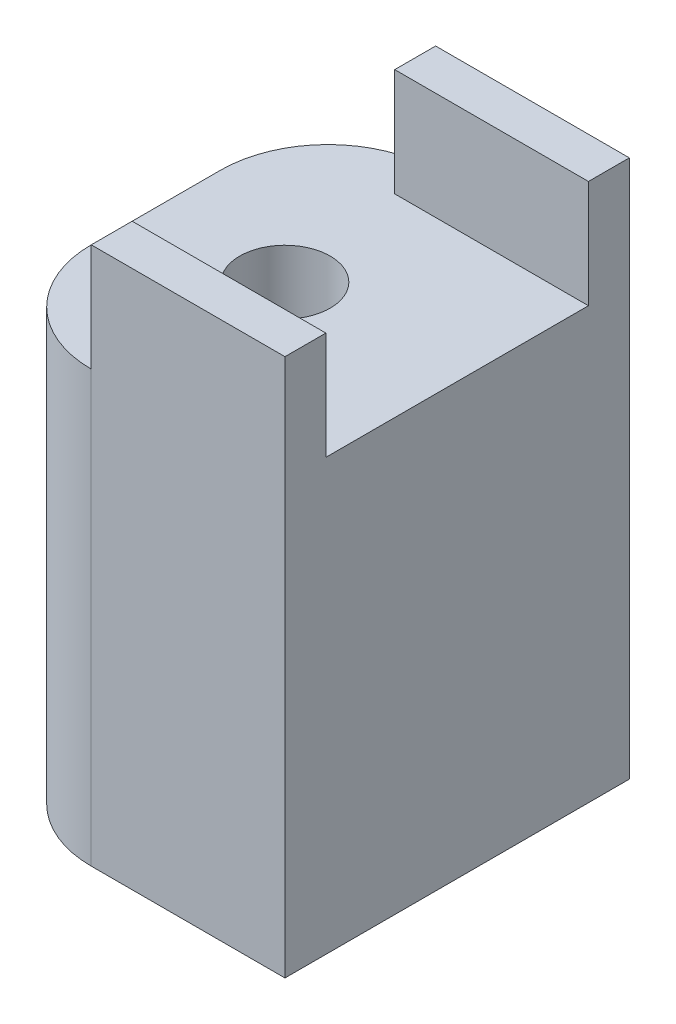
ISO-10303-21;
HEADER;
FILE_DESCRIPTION(('STEP AP214'),'2;1');
FILE_NAME('part.step','',(''),(''),'','','');
FILE_SCHEMA(('AUTOMOTIVE_DESIGN { 1 0 10303 214 1 1 1 1 }'));
ENDSEC;
DATA;
#1=APPLICATION_CONTEXT('core data for automotive mechanical design processes');
#2=APPLICATION_PROTOCOL_DEFINITION('international standard','automotive_design',2000,#1);
#3=PRODUCT_CONTEXT('',#1,'mechanical');
#4=PRODUCT('Part','Part','',(#3));
#5=PRODUCT_RELATED_PRODUCT_CATEGORY('part','',(#4));
#6=PRODUCT_DEFINITION_FORMATION('','',#4);
#7=PRODUCT_DEFINITION_CONTEXT('part definition',#1,'design');
#8=PRODUCT_DEFINITION('design','',#6,#7);
#9=PRODUCT_DEFINITION_SHAPE('','',#8);
#10=(LENGTH_UNIT() NAMED_UNIT(*) SI_UNIT(.MILLI.,.METRE.));
#11=(NAMED_UNIT(*) PLANE_ANGLE_UNIT() SI_UNIT($,.RADIAN.));
#12=(NAMED_UNIT(*) SI_UNIT($,.STERADIAN.) SOLID_ANGLE_UNIT());
#13=UNCERTAINTY_MEASURE_WITH_UNIT(LENGTH_MEASURE(1.E-05),#10,'distance_accuracy_value','');
#14=(GEOMETRIC_REPRESENTATION_CONTEXT(3) GLOBAL_UNCERTAINTY_ASSIGNED_CONTEXT((#13)) GLOBAL_UNIT_ASSIGNED_CONTEXT((#10,
#11,#12)) REPRESENTATION_CONTEXT('',''));
#15=CARTESIAN_POINT('',(0.,0.,0.));
#16=DIRECTION('',(0.,0.,1.));
#17=DIRECTION('',(1.,0.,0.));
#18=AXIS2_PLACEMENT_3D('',#15,#16,#17);
#19=CARTESIAN_POINT('',(0.,20.,0.));
#20=DIRECTION('',(0.,1.,0.));
#21=DIRECTION('',(0.,0.,1.));
#22=AXIS2_PLACEMENT_3D('',#19,#20,#21);
#23=PLANE('',#22);
#24=CARTESIAN_POINT('',(0.,20.,0.));
#25=DIRECTION('',(0.,1.,0.));
#26=DIRECTION('',(0.,0.,1.));
#27=AXIS2_PLACEMENT_3D('',#24,#25,#26);
#28=CIRCLE('',#27,2.1);
#29=CARTESIAN_POINT('',(0.,20.,2.1));
#30=VERTEX_POINT('',#29);
#31=EDGE_CURVE('E191',#30,#30,#28,.T.);
#32=ORIENTED_EDGE('',*,*,#31,.F.);
#33=EDGE_LOOP('',(#32));
#34=FACE_BOUND('',#33,.T.);
#35=DIRECTION('',(0.,0.,1.));
#36=VECTOR('',#35,1.);
#37=CARTESIAN_POINT('',(-1.,20.,8.));
#38=LINE('',#37,#36);
#39=CARTESIAN_POINT('',(-0.999999999999999,20.,6.1));
#40=VERTEX_POINT('',#39);
#41=CARTESIAN_POINT('',(-1.,20.,8.));
#42=VERTEX_POINT('',#41);
#43=EDGE_CURVE('E127',#40,#42,#38,.T.);
#44=ORIENTED_EDGE('',*,*,#43,.F.);
#45=DIRECTION('',(-1.,0.,0.));
#46=VECTOR('',#45,1.);
#47=CARTESIAN_POINT('',(8.,20.,6.1));
#48=LINE('',#47,#46);
#49=CARTESIAN_POINT('',(8.,20.,6.1));
#50=VERTEX_POINT('',#49);
#51=EDGE_CURVE('E133',#50,#40,#48,.T.);
#52=ORIENTED_EDGE('',*,*,#51,.F.);
#53=DIRECTION('',(0.,0.,1.));
#54=VECTOR('',#53,1.);
#55=CARTESIAN_POINT('',(8.,20.,0.));
#56=LINE('',#55,#54);
#57=CARTESIAN_POINT('',(8.,20.,-6.1));
#58=VERTEX_POINT('',#57);
#59=EDGE_CURVE('E66',#58,#50,#56,.T.);
#60=ORIENTED_EDGE('',*,*,#59,.F.);
#61=DIRECTION('',(1.,0.,0.));
#62=VECTOR('',#61,1.);
#63=CARTESIAN_POINT('',(8.,20.,-6.1));
#64=LINE('',#63,#62);
#65=CARTESIAN_POINT('',(-1.,20.,-6.1));
#66=VERTEX_POINT('',#65);
#67=EDGE_CURVE('E221',#66,#58,#64,.T.);
#68=ORIENTED_EDGE('',*,*,#67,.F.);
#69=DIRECTION('',(0.,0.,1.));
#70=VECTOR('',#69,1.);
#71=CARTESIAN_POINT('',(-1.,20.,-8.));
#72=LINE('',#71,#70);
#73=CARTESIAN_POINT('',(-1.,20.,-8.));
#74=VERTEX_POINT('',#73);
#75=EDGE_CURVE('E168',#74,#66,#72,.T.);
#76=ORIENTED_EDGE('',*,*,#75,.F.);
#77=CARTESIAN_POINT('',(-1.,20.,-3.));
#78=DIRECTION('',(0.,1.,0.));
#79=DIRECTION('',(0.,0.,1.));
#80=AXIS2_PLACEMENT_3D('',#77,#78,#79);
#81=CIRCLE('',#80,5.);
#82=CARTESIAN_POINT('',(-6.,20.,-3.));
#83=VERTEX_POINT('',#82);
#84=EDGE_CURVE('E51',#74,#83,#81,.T.);
#85=ORIENTED_EDGE('',*,*,#84,.T.);
#86=DIRECTION('',(0.,0.,1.));
#87=VECTOR('',#86,1.);
#88=CARTESIAN_POINT('',(-6.,20.,0.));
#89=LINE('',#88,#87);
#90=CARTESIAN_POINT('',(-6.,20.,3.));
#91=VERTEX_POINT('',#90);
#92=EDGE_CURVE('E147',#83,#91,#89,.T.);
#93=ORIENTED_EDGE('',*,*,#92,.T.);
#94=CARTESIAN_POINT('',(-1.,20.,3.));
#95=DIRECTION('',(0.,1.,0.));
#96=DIRECTION('',(0.,0.,1.));
#97=AXIS2_PLACEMENT_3D('',#94,#95,#96);
#98=CIRCLE('',#97,5.);
#99=EDGE_CURVE('E145',#91,#42,#98,.T.);
#100=ORIENTED_EDGE('',*,*,#99,.T.);
#101=EDGE_LOOP('',(#44,#52,#60,#68,#76,#85,#93,#100));
#102=FACE_BOUND('',#101,.T.);
#103=ADVANCED_FACE('F43',(#34,#102),#23,.T.);
#104=CARTESIAN_POINT('',(0.,20.,8.));
#105=DIRECTION('',(0.,0.,-1.));
#106=DIRECTION('',(-1.,0.,0.));
#107=AXIS2_PLACEMENT_3D('',#104,#105,#106);
#108=PLANE('',#107);
#109=DIRECTION('',(0.,-1.,0.));
#110=VECTOR('',#109,1.);
#111=CARTESIAN_POINT('',(8.,20.,8.));
#112=LINE('',#111,#110);
#113=CARTESIAN_POINT('',(8.,25.,8.));
#114=VERTEX_POINT('',#113);
#115=CARTESIAN_POINT('',(8.,0.,8.));
#116=VERTEX_POINT('',#115);
#117=EDGE_CURVE('E198',#114,#116,#112,.T.);
#118=ORIENTED_EDGE('',*,*,#117,.F.);
#119=DIRECTION('',(1.,0.,0.));
#120=VECTOR('',#119,1.);
#121=CARTESIAN_POINT('',(8.,25.,8.));
#122=LINE('',#121,#120);
#123=CARTESIAN_POINT('',(-1.,25.,8.));
#124=VERTEX_POINT('',#123);
#125=EDGE_CURVE('E134',#124,#114,#122,.T.);
#126=ORIENTED_EDGE('',*,*,#125,.F.);
#127=DIRECTION('',(0.,-1.,0.));
#128=VECTOR('',#127,1.);
#129=CARTESIAN_POINT('',(-1.,25.,8.));
#130=LINE('',#129,#128);
#131=EDGE_CURVE('E130',#124,#42,#130,.T.);
#132=ORIENTED_EDGE('',*,*,#131,.T.);
#133=DIRECTION('',(0.,-1.,0.));
#134=VECTOR('',#133,1.);
#135=CARTESIAN_POINT('',(-1.,20.,8.));
#136=LINE('',#135,#134);
#137=CARTESIAN_POINT('',(-1.,0.,8.));
#138=VERTEX_POINT('',#137);
#139=EDGE_CURVE('E11',#42,#138,#136,.T.);
#140=ORIENTED_EDGE('',*,*,#139,.T.);
#141=DIRECTION('',(1.,0.,0.));
#142=VECTOR('',#141,1.);
#143=CARTESIAN_POINT('',(0.,0.,8.));
#144=LINE('',#143,#142);
#145=EDGE_CURVE('E193',#138,#116,#144,.T.);
#146=ORIENTED_EDGE('',*,*,#145,.T.);
#147=EDGE_LOOP('',(#118,#126,#132,#140,#146));
#148=FACE_BOUND('',#147,.T.);
#149=ADVANCED_FACE('F137',(#148),#108,.F.);
#150=CARTESIAN_POINT('',(8.,20.,0.));
#151=DIRECTION('',(1.,0.,0.));
#152=DIRECTION('',(0.,0.,-1.));
#153=AXIS2_PLACEMENT_3D('',#150,#151,#152);
#154=PLANE('',#153);
#155=DIRECTION('',(0.,0.,1.));
#156=VECTOR('',#155,1.);
#157=CARTESIAN_POINT('',(8.,0.,0.));
#158=LINE('',#157,#156);
#159=CARTESIAN_POINT('',(8.,0.,-8.));
#160=VERTEX_POINT('',#159);
#161=EDGE_CURVE('E189',#160,#116,#158,.T.);
#162=ORIENTED_EDGE('',*,*,#161,.F.);
#163=DIRECTION('',(0.,-1.,0.));
#164=VECTOR('',#163,1.);
#165=CARTESIAN_POINT('',(8.,20.,-8.));
#166=LINE('',#165,#164);
#167=CARTESIAN_POINT('',(8.,25.,-8.));
#168=VERTEX_POINT('',#167);
#169=EDGE_CURVE('E175',#168,#160,#166,.T.);
#170=ORIENTED_EDGE('',*,*,#169,.F.);
#171=DIRECTION('',(0.,0.,-1.));
#172=VECTOR('',#171,1.);
#173=CARTESIAN_POINT('',(8.,25.,-8.));
#174=LINE('',#173,#172);
#175=CARTESIAN_POINT('',(8.,25.,-6.1));
#176=VERTEX_POINT('',#175);
#177=EDGE_CURVE('E223',#176,#168,#174,.T.);
#178=ORIENTED_EDGE('',*,*,#177,.F.);
#179=DIRECTION('',(0.,-1.,0.));
#180=VECTOR('',#179,1.);
#181=CARTESIAN_POINT('',(8.,25.,-6.1));
#182=LINE('',#181,#180);
#183=EDGE_CURVE('E217',#176,#58,#182,.T.);
#184=ORIENTED_EDGE('',*,*,#183,.T.);
#185=ORIENTED_EDGE('',*,*,#59,.T.);
#186=DIRECTION('',(0.,-1.,0.));
#187=VECTOR('',#186,1.);
#188=CARTESIAN_POINT('',(8.,25.,6.1));
#189=LINE('',#188,#187);
#190=CARTESIAN_POINT('',(8.,25.,6.1));
#191=VERTEX_POINT('',#190);
#192=EDGE_CURVE('E239',#191,#50,#189,.T.);
#193=ORIENTED_EDGE('',*,*,#192,.F.);
#194=DIRECTION('',(0.,0.,-1.));
#195=VECTOR('',#194,1.);
#196=CARTESIAN_POINT('',(8.,25.,8.));
#197=LINE('',#196,#195);
#198=EDGE_CURVE('E204',#114,#191,#197,.T.);
#199=ORIENTED_EDGE('',*,*,#198,.F.);
#200=ORIENTED_EDGE('',*,*,#117,.T.);
#201=EDGE_LOOP('',(#162,#170,#178,#184,#185,#193,#199,#200));
#202=FACE_BOUND('',#201,.T.);
#203=ADVANCED_FACE('F202',(#202),#154,.T.);
#204=CARTESIAN_POINT('',(0.,20.,-8.));
#205=DIRECTION('',(0.,0.,-1.));
#206=DIRECTION('',(-1.,0.,0.));
#207=AXIS2_PLACEMENT_3D('',#204,#205,#206);
#208=PLANE('',#207);
#209=DIRECTION('',(1.,0.,0.));
#210=VECTOR('',#209,1.);
#211=CARTESIAN_POINT('',(0.,0.,-8.));
#212=LINE('',#211,#210);
#213=CARTESIAN_POINT('',(-1.,0.,-8.));
#214=VERTEX_POINT('',#213);
#215=EDGE_CURVE('E181',#214,#160,#212,.T.);
#216=ORIENTED_EDGE('',*,*,#215,.F.);
#217=DIRECTION('',(0.,-1.,0.));
#218=VECTOR('',#217,1.);
#219=CARTESIAN_POINT('',(-1.,20.,-8.));
#220=LINE('',#219,#218);
#221=EDGE_CURVE('E150',#214,#74,#220,.F.);
#222=ORIENTED_EDGE('',*,*,#221,.T.);
#223=DIRECTION('',(0.,-1.,0.));
#224=VECTOR('',#223,1.);
#225=CARTESIAN_POINT('',(-1.,25.,-8.));
#226=LINE('',#225,#224);
#227=CARTESIAN_POINT('',(-1.,25.,-8.));
#228=VERTEX_POINT('',#227);
#229=EDGE_CURVE('E207',#228,#74,#226,.T.);
#230=ORIENTED_EDGE('',*,*,#229,.F.);
#231=DIRECTION('',(-1.,0.,0.));
#232=VECTOR('',#231,1.);
#233=CARTESIAN_POINT('',(8.,25.,-8.));
#234=LINE('',#233,#232);
#235=EDGE_CURVE('E228',#168,#228,#234,.T.);
#236=ORIENTED_EDGE('',*,*,#235,.F.);
#237=ORIENTED_EDGE('',*,*,#169,.T.);
#238=EDGE_LOOP('',(#216,#222,#230,#236,#237));
#239=FACE_BOUND('',#238,.T.);
#240=ADVANCED_FACE('F185',(#239),#208,.T.);
#241=CARTESIAN_POINT('',(0.,20.,0.));
#242=DIRECTION('',(0.,-1.,0.));
#243=DIRECTION('',(0.,0.,-1.));
#244=AXIS2_PLACEMENT_3D('',#241,#242,#243);
#245=CYLINDRICAL_SURFACE('',#244,2.1);
#246=ORIENTED_EDGE('',*,*,#31,.T.);
#247=EDGE_LOOP('',(#246));
#248=FACE_BOUND('',#247,.T.);
#249=CARTESIAN_POINT('',(0.,0.,0.));
#250=DIRECTION('',(0.,1.,0.));
#251=DIRECTION('',(0.,0.,1.));
#252=AXIS2_PLACEMENT_3D('',#249,#250,#251);
#253=CIRCLE('',#252,2.1);
#254=CARTESIAN_POINT('',(0.,0.,2.1));
#255=VERTEX_POINT('',#254);
#256=EDGE_CURVE('E205',#255,#255,#253,.T.);
#257=ORIENTED_EDGE('',*,*,#256,.F.);
#258=EDGE_LOOP('',(#257));
#259=FACE_BOUND('',#258,.T.);
#260=ADVANCED_FACE('F278',(#248,#259),#245,.F.);
#261=CARTESIAN_POINT('',(-6.,20.,0.));
#262=DIRECTION('',(1.,0.,0.));
#263=DIRECTION('',(0.,0.,-1.));
#264=AXIS2_PLACEMENT_3D('',#261,#262,#263);
#265=PLANE('',#264);
#266=ORIENTED_EDGE('',*,*,#92,.F.);
#267=DIRECTION('',(0.,-1.,0.));
#268=VECTOR('',#267,1.);
#269=CARTESIAN_POINT('',(-6.,0.,-3.));
#270=LINE('',#269,#268);
#271=CARTESIAN_POINT('',(-6.,0.,-3.));
#272=VERTEX_POINT('',#271);
#273=EDGE_CURVE('E158',#83,#272,#270,.T.);
#274=ORIENTED_EDGE('',*,*,#273,.T.);
#275=DIRECTION('',(0.,0.,1.));
#276=VECTOR('',#275,1.);
#277=CARTESIAN_POINT('',(-6.,0.,0.));
#278=LINE('',#277,#276);
#279=CARTESIAN_POINT('',(-6.,0.,3.));
#280=VERTEX_POINT('',#279);
#281=EDGE_CURVE('E183',#272,#280,#278,.T.);
#282=ORIENTED_EDGE('',*,*,#281,.T.);
#283=DIRECTION('',(0.,-1.,0.));
#284=VECTOR('',#283,1.);
#285=CARTESIAN_POINT('',(-6.,20.,3.));
#286=LINE('',#285,#284);
#287=EDGE_CURVE('E153',#280,#91,#286,.F.);
#288=ORIENTED_EDGE('',*,*,#287,.T.);
#289=EDGE_LOOP('',(#266,#274,#282,#288));
#290=FACE_BOUND('',#289,.T.);
#291=ADVANCED_FACE('F174',(#290),#265,.F.);
#292=CARTESIAN_POINT('',(0.,0.,0.));
#293=DIRECTION('',(0.,1.,0.));
#294=DIRECTION('',(0.,0.,1.));
#295=AXIS2_PLACEMENT_3D('',#292,#293,#294);
#296=PLANE('',#295);
#297=ORIENTED_EDGE('',*,*,#256,.T.);
#298=EDGE_LOOP('',(#297));
#299=FACE_BOUND('',#298,.T.);
#300=ORIENTED_EDGE('',*,*,#281,.F.);
#301=CARTESIAN_POINT('',(-1.,0.,-3.));
#302=DIRECTION('',(0.,1.,0.));
#303=DIRECTION('',(0.,0.,1.));
#304=AXIS2_PLACEMENT_3D('',#301,#302,#303);
#305=CIRCLE('',#304,5.);
#306=EDGE_CURVE('E157',#272,#214,#305,.F.);
#307=ORIENTED_EDGE('',*,*,#306,.T.);
#308=ORIENTED_EDGE('',*,*,#215,.T.);
#309=ORIENTED_EDGE('',*,*,#161,.T.);
#310=ORIENTED_EDGE('',*,*,#145,.F.);
#311=CARTESIAN_POINT('',(-1.,0.,3.));
#312=DIRECTION('',(0.,1.,0.));
#313=DIRECTION('',(0.,0.,1.));
#314=AXIS2_PLACEMENT_3D('',#311,#312,#313);
#315=CIRCLE('',#314,5.);
#316=EDGE_CURVE('E152',#138,#280,#315,.F.);
#317=ORIENTED_EDGE('',*,*,#316,.T.);
#318=EDGE_LOOP('',(#300,#307,#308,#309,#310,#317));
#319=FACE_BOUND('',#318,.T.);
#320=ADVANCED_FACE('F179',(#299,#319),#296,.F.);
#321=CARTESIAN_POINT('',(-1.,20.,-3.));
#322=DIRECTION('',(0.,1.,0.));
#323=DIRECTION('',(0.,0.,1.));
#324=AXIS2_PLACEMENT_3D('',#321,#322,#323);
#325=CYLINDRICAL_SURFACE('',#324,5.);
#326=ORIENTED_EDGE('',*,*,#84,.F.);
#327=ORIENTED_EDGE('',*,*,#221,.F.);
#328=ORIENTED_EDGE('',*,*,#306,.F.);
#329=ORIENTED_EDGE('',*,*,#273,.F.);
#330=EDGE_LOOP('',(#326,#327,#328,#329));
#331=FACE_BOUND('',#330,.T.);
#332=ADVANCED_FACE('F177',(#331),#325,.T.);
#333=CARTESIAN_POINT('',(-1.,20.,3.));
#334=DIRECTION('',(0.,-1.,0.));
#335=DIRECTION('',(0.,0.,-1.));
#336=AXIS2_PLACEMENT_3D('',#333,#334,#335);
#337=CYLINDRICAL_SURFACE('',#336,5.);
#338=ORIENTED_EDGE('',*,*,#99,.F.);
#339=ORIENTED_EDGE('',*,*,#287,.F.);
#340=ORIENTED_EDGE('',*,*,#316,.F.);
#341=ORIENTED_EDGE('',*,*,#139,.F.);
#342=EDGE_LOOP('',(#338,#339,#340,#341));
#343=FACE_BOUND('',#342,.T.);
#344=ADVANCED_FACE('F45',(#343),#337,.T.);
#345=CARTESIAN_POINT('',(-1.,25.,-8.));
#346=DIRECTION('',(1.,0.,0.));
#347=DIRECTION('',(0.,0.,-1.));
#348=AXIS2_PLACEMENT_3D('',#345,#346,#347);
#349=PLANE('',#348);
#350=ORIENTED_EDGE('',*,*,#75,.T.);
#351=DIRECTION('',(0.,-1.,0.));
#352=VECTOR('',#351,1.);
#353=CARTESIAN_POINT('',(-1.,25.,-6.1));
#354=LINE('',#353,#352);
#355=CARTESIAN_POINT('',(-1.,25.,-6.1));
#356=VERTEX_POINT('',#355);
#357=EDGE_CURVE('E214',#356,#66,#354,.T.);
#358=ORIENTED_EDGE('',*,*,#357,.F.);
#359=DIRECTION('',(0.,0.,1.));
#360=VECTOR('',#359,1.);
#361=CARTESIAN_POINT('',(-1.,25.,-8.));
#362=LINE('',#361,#360);
#363=EDGE_CURVE('E226',#228,#356,#362,.T.);
#364=ORIENTED_EDGE('',*,*,#363,.F.);
#365=ORIENTED_EDGE('',*,*,#229,.T.);
#366=EDGE_LOOP('',(#350,#358,#364,#365));
#367=FACE_BOUND('',#366,.T.);
#368=ADVANCED_FACE('F250',(#367),#349,.F.);
#369=CARTESIAN_POINT('',(8.,25.,-6.1));
#370=DIRECTION('',(0.,0.,-1.));
#371=DIRECTION('',(-1.,0.,0.));
#372=AXIS2_PLACEMENT_3D('',#369,#370,#371);
#373=PLANE('',#372);
#374=ORIENTED_EDGE('',*,*,#67,.T.);
#375=ORIENTED_EDGE('',*,*,#183,.F.);
#376=DIRECTION('',(1.,0.,0.));
#377=VECTOR('',#376,1.);
#378=CARTESIAN_POINT('',(8.,25.,-6.1));
#379=LINE('',#378,#377);
#380=EDGE_CURVE('E220',#356,#176,#379,.T.);
#381=ORIENTED_EDGE('',*,*,#380,.F.);
#382=ORIENTED_EDGE('',*,*,#357,.T.);
#383=EDGE_LOOP('',(#374,#375,#381,#382));
#384=FACE_BOUND('',#383,.T.);
#385=ADVANCED_FACE('F247',(#384),#373,.F.);
#386=CARTESIAN_POINT('',(0.,25.,0.));
#387=DIRECTION('',(0.,-1.,0.));
#388=DIRECTION('',(0.,0.,-1.));
#389=AXIS2_PLACEMENT_3D('',#386,#387,#388);
#390=PLANE('',#389);
#391=ORIENTED_EDGE('',*,*,#177,.T.);
#392=ORIENTED_EDGE('',*,*,#235,.T.);
#393=ORIENTED_EDGE('',*,*,#363,.T.);
#394=ORIENTED_EDGE('',*,*,#380,.T.);
#395=EDGE_LOOP('',(#391,#392,#393,#394));
#396=FACE_BOUND('',#395,.T.);
#397=ADVANCED_FACE('F253',(#396),#390,.F.);
#398=CARTESIAN_POINT('',(8.,25.,6.1));
#399=DIRECTION('',(0.,0.,1.));
#400=DIRECTION('',(1.,0.,0.));
#401=AXIS2_PLACEMENT_3D('',#398,#399,#400);
#402=PLANE('',#401);
#403=ORIENTED_EDGE('',*,*,#51,.T.);
#404=DIRECTION('',(0.,-1.,0.));
#405=VECTOR('',#404,1.);
#406=CARTESIAN_POINT('',(-0.999999999999999,25.,6.1));
#407=LINE('',#406,#405);
#408=CARTESIAN_POINT('',(-0.999999999999999,25.,6.1));
#409=VERTEX_POINT('',#408);
#410=EDGE_CURVE('E58',#409,#40,#407,.T.);
#411=ORIENTED_EDGE('',*,*,#410,.F.);
#412=DIRECTION('',(-1.,0.,0.));
#413=VECTOR('',#412,1.);
#414=CARTESIAN_POINT('',(8.,25.,6.1));
#415=LINE('',#414,#413);
#416=EDGE_CURVE('E234',#191,#409,#415,.T.);
#417=ORIENTED_EDGE('',*,*,#416,.F.);
#418=ORIENTED_EDGE('',*,*,#192,.T.);
#419=EDGE_LOOP('',(#403,#411,#417,#418));
#420=FACE_BOUND('',#419,.T.);
#421=ADVANCED_FACE('F242',(#420),#402,.F.);
#422=CARTESIAN_POINT('',(-1.,25.,8.));
#423=DIRECTION('',(1.,0.,0.));
#424=DIRECTION('',(0.,0.,-1.));
#425=AXIS2_PLACEMENT_3D('',#422,#423,#424);
#426=PLANE('',#425);
#427=ORIENTED_EDGE('',*,*,#43,.T.);
#428=ORIENTED_EDGE('',*,*,#131,.F.);
#429=DIRECTION('',(0.,0.,1.));
#430=VECTOR('',#429,1.);
#431=CARTESIAN_POINT('',(-1.,25.,8.));
#432=LINE('',#431,#430);
#433=EDGE_CURVE('E141',#409,#124,#432,.T.);
#434=ORIENTED_EDGE('',*,*,#433,.F.);
#435=ORIENTED_EDGE('',*,*,#410,.T.);
#436=EDGE_LOOP('',(#427,#428,#434,#435));
#437=FACE_BOUND('',#436,.T.);
#438=ADVANCED_FACE('F129',(#437),#426,.F.);
#439=CARTESIAN_POINT('',(0.,25.,0.));
#440=DIRECTION('',(0.,-1.,0.));
#441=DIRECTION('',(0.,0.,-1.));
#442=AXIS2_PLACEMENT_3D('',#439,#440,#441);
#443=PLANE('',#442);
#444=ORIENTED_EDGE('',*,*,#125,.T.);
#445=ORIENTED_EDGE('',*,*,#198,.T.);
#446=ORIENTED_EDGE('',*,*,#416,.T.);
#447=ORIENTED_EDGE('',*,*,#433,.T.);
#448=EDGE_LOOP('',(#444,#445,#446,#447));
#449=FACE_BOUND('',#448,.T.);
#450=ADVANCED_FACE('F317',(#449),#443,.F.);
#451=CLOSED_SHELL('',(#103,#149,#203,#240,#260,#291,#320,#332,#344,#368,#385,#397,#421,#438,#450));
#452=MANIFOLD_SOLID_BREP('B2',#451);
#453=ADVANCED_BREP_SHAPE_REPRESENTATION('',(#18,#452),#14);
#454=SHAPE_DEFINITION_REPRESENTATION(#9,#453);
ENDSEC;
END-ISO-10303-21;
